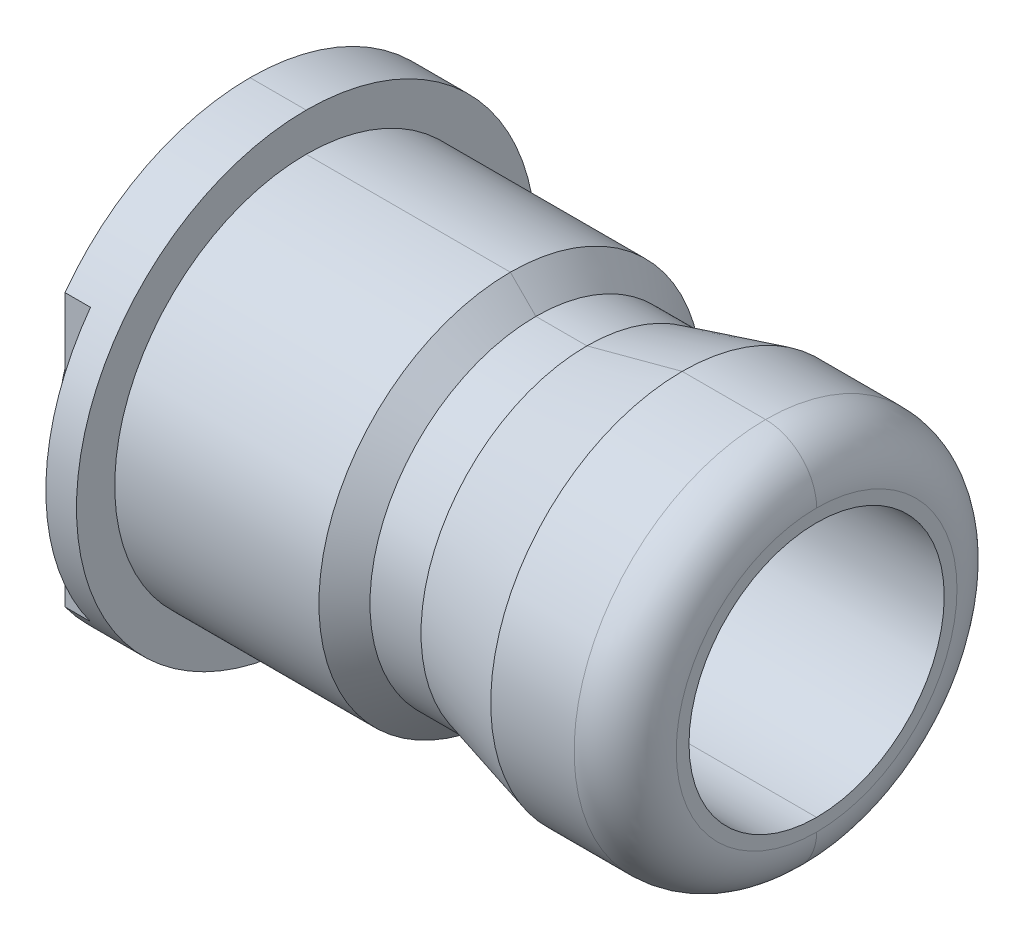
ISO-10303-21;
HEADER;
FILE_DESCRIPTION(('STEP AP214'),'2;1');
FILE_NAME('part.step','',(''),(''),'','','');
FILE_SCHEMA(('AUTOMOTIVE_DESIGN { 1 0 10303 214 1 1 1 1 }'));
ENDSEC;
DATA;
#1=APPLICATION_CONTEXT('core data for automotive mechanical design processes');
#2=APPLICATION_PROTOCOL_DEFINITION('international standard','automotive_design',2000,#1);
#3=PRODUCT_CONTEXT('',#1,'mechanical');
#4=PRODUCT('Part','Part','',(#3));
#5=PRODUCT_RELATED_PRODUCT_CATEGORY('part','',(#4));
#6=PRODUCT_DEFINITION_FORMATION('','',#4);
#7=PRODUCT_DEFINITION_CONTEXT('part definition',#1,'design');
#8=PRODUCT_DEFINITION('design','',#6,#7);
#9=PRODUCT_DEFINITION_SHAPE('','',#8);
#10=(LENGTH_UNIT() NAMED_UNIT(*) SI_UNIT(.MILLI.,.METRE.));
#11=(NAMED_UNIT(*) PLANE_ANGLE_UNIT() SI_UNIT($,.RADIAN.));
#12=(NAMED_UNIT(*) SI_UNIT($,.STERADIAN.) SOLID_ANGLE_UNIT());
#13=UNCERTAINTY_MEASURE_WITH_UNIT(LENGTH_MEASURE(1.E-05),#10,'distance_accuracy_value','');
#14=(GEOMETRIC_REPRESENTATION_CONTEXT(3) GLOBAL_UNCERTAINTY_ASSIGNED_CONTEXT((#13)) GLOBAL_UNIT_ASSIGNED_CONTEXT((#10,
#11,#12)) REPRESENTATION_CONTEXT('',''));
#15=CARTESIAN_POINT('',(0.,0.,0.));
#16=DIRECTION('',(0.,0.,1.));
#17=DIRECTION('',(1.,0.,0.));
#18=AXIS2_PLACEMENT_3D('',#15,#16,#17);
#19=CARTESIAN_POINT('',(-4.36,0.,0.));
#20=DIRECTION('',(1.,0.,0.));
#21=DIRECTION('',(0.,-1.,0.));
#22=AXIS2_PLACEMENT_3D('',#19,#20,#21);
#23=CYLINDRICAL_SURFACE('',#22,9.);
#24=DIRECTION('',(1.,0.,0.));
#25=VECTOR('',#24,1.);
#26=CARTESIAN_POINT('',(-2.2,5.332682251925,-7.25));
#27=LINE('',#26,#25);
#28=CARTESIAN_POINT('',(-2.2,5.332682251925,-7.25));
#29=VERTEX_POINT('',#28);
#30=CARTESIAN_POINT('',(-1.2,5.332682251925,-7.25));
#31=VERTEX_POINT('',#30);
#32=EDGE_CURVE('E27',#29,#31,#27,.T.);
#33=ORIENTED_EDGE('',*,*,#32,.F.);
#34=CARTESIAN_POINT('',(-2.2,0.,0.));
#35=DIRECTION('',(-1.,0.,0.));
#36=DIRECTION('',(0.,1.,0.));
#37=AXIS2_PLACEMENT_3D('',#34,#35,#36);
#38=CIRCLE('',#37,9.);
#39=CARTESIAN_POINT('',(-2.2,9.,0.));
#40=VERTEX_POINT('',#39);
#41=EDGE_CURVE('E353',#40,#29,#38,.T.);
#42=ORIENTED_EDGE('',*,*,#41,.F.);
#43=DIRECTION('',(-1.,0.,0.));
#44=VECTOR('',#43,1.);
#45=CARTESIAN_POINT('',(0.,9.,0.));
#46=LINE('',#45,#44);
#47=CARTESIAN_POINT('',(0.,9.,0.));
#48=VERTEX_POINT('',#47);
#49=EDGE_CURVE('E252',#48,#40,#46,.T.);
#50=ORIENTED_EDGE('',*,*,#49,.F.);
#51=CARTESIAN_POINT('',(0.,0.,0.));
#52=DIRECTION('',(-1.,0.,0.));
#53=DIRECTION('',(0.,1.,0.));
#54=AXIS2_PLACEMENT_3D('',#51,#52,#53);
#55=CIRCLE('',#54,9.);
#56=CARTESIAN_POINT('',(0.,-9.,0.));
#57=VERTEX_POINT('',#56);
#58=EDGE_CURVE('E369',#48,#57,#55,.T.);
#59=ORIENTED_EDGE('',*,*,#58,.T.);
#60=DIRECTION('',(-1.,0.,0.));
#61=VECTOR('',#60,1.);
#62=CARTESIAN_POINT('',(0.,-9.,0.));
#63=LINE('',#62,#61);
#64=CARTESIAN_POINT('',(-2.2,-9.,0.));
#65=VERTEX_POINT('',#64);
#66=EDGE_CURVE('E249',#57,#65,#63,.T.);
#67=ORIENTED_EDGE('',*,*,#66,.T.);
#68=CARTESIAN_POINT('',(-2.2,0.,0.));
#69=DIRECTION('',(-1.,0.,0.));
#70=DIRECTION('',(0.,-0.59252025021389,-0.805555555555586));
#71=AXIS2_PLACEMENT_3D('',#68,#69,#70);
#72=CIRCLE('',#71,9.);
#73=CARTESIAN_POINT('',(-2.2,-5.332682251925,-7.25));
#74=VERTEX_POINT('',#73);
#75=EDGE_CURVE('E387',#74,#65,#72,.T.);
#76=ORIENTED_EDGE('',*,*,#75,.F.);
#77=DIRECTION('',(1.,0.,0.));
#78=VECTOR('',#77,1.);
#79=CARTESIAN_POINT('',(-2.2,-5.332682251925,-7.25));
#80=LINE('',#79,#78);
#81=CARTESIAN_POINT('',(-1.2,-5.332682251925,-7.25));
#82=VERTEX_POINT('',#81);
#83=EDGE_CURVE('E11',#74,#82,#80,.T.);
#84=ORIENTED_EDGE('',*,*,#83,.T.);
#85=CARTESIAN_POINT('',(-1.2,0.,0.));
#86=DIRECTION('',(1.,0.,0.));
#87=DIRECTION('',(0.,-0.59252025021389,-0.805555555555586));
#88=AXIS2_PLACEMENT_3D('',#85,#86,#87);
#89=CIRCLE('',#88,9.);
#90=EDGE_CURVE('E388',#82,#31,#89,.T.);
#91=ORIENTED_EDGE('',*,*,#90,.T.);
#92=EDGE_LOOP('',(#33,#42,#50,#59,#67,#76,#84,#91));
#93=FACE_BOUND('',#92,.T.);
#94=ADVANCED_FACE('F16',(#93),#23,.T.);
#95=CARTESIAN_POINT('',(-2.2,-5.332682251925,-7.25));
#96=DIRECTION('',(0.,0.,1.));
#97=DIRECTION('',(1.,0.,0.));
#98=AXIS2_PLACEMENT_3D('',#95,#96,#97);
#99=PLANE('',#98);
#100=ORIENTED_EDGE('',*,*,#32,.T.);
#101=DIRECTION('',(0.,1.,0.));
#102=VECTOR('',#101,1.);
#103=CARTESIAN_POINT('',(-1.2,-5.332682251925,-7.25));
#104=LINE('',#103,#102);
#105=EDGE_CURVE('E362',#82,#31,#104,.T.);
#106=ORIENTED_EDGE('',*,*,#105,.F.);
#107=ORIENTED_EDGE('',*,*,#83,.F.);
#108=DIRECTION('',(0.,1.,0.));
#109=VECTOR('',#108,1.);
#110=CARTESIAN_POINT('',(-2.2,-5.332682251925,-7.25));
#111=LINE('',#110,#109);
#112=EDGE_CURVE('E348',#74,#29,#111,.T.);
#113=ORIENTED_EDGE('',*,*,#112,.T.);
#114=EDGE_LOOP('',(#100,#106,#107,#113));
#115=FACE_BOUND('',#114,.T.);
#116=ADVANCED_FACE('F491',(#115),#99,.F.);
#117=CARTESIAN_POINT('',(1.085559462452,4.5,0.));
#118=DIRECTION('',(-1.,0.,0.));
#119=DIRECTION('',(0.,1.,0.));
#120=AXIS2_PLACEMENT_3D('',#117,#118,#119);
#121=CONICAL_SURFACE('',#120,0.5303965024516,1.0471975511964);
#122=CARTESIAN_POINT('',(0.8,4.5,0.));
#123=DIRECTION('',(-1.,0.,0.));
#124=DIRECTION('',(0.,1.,0.));
#125=AXIS2_PLACEMENT_3D('',#122,#123,#124);
#126=CIRCLE('',#125,1.025);
#127=CARTESIAN_POINT('',(0.8,5.525,0.));
#128=VERTEX_POINT('',#127);
#129=CARTESIAN_POINT('',(0.8,3.475,0.));
#130=VERTEX_POINT('',#129);
#131=EDGE_CURVE('E340',#128,#130,#126,.T.);
#132=ORIENTED_EDGE('',*,*,#131,.T.);
#133=DIRECTION('',(-0.500000000000017,-0.866025403784429,0.));
#134=VECTOR('',#133,1.);
#135=CARTESIAN_POINT('',(1.391784025919,4.5,0.));
#136=LINE('',#135,#134);
#137=CARTESIAN_POINT('',(1.391784025919,4.5,0.));
#138=VERTEX_POINT('',#137);
#139=EDGE_CURVE('E448',#138,#130,#136,.T.);
#140=ORIENTED_EDGE('',*,*,#139,.F.);
#141=DIRECTION('',(-0.500000000000017,0.866025403784429,0.));
#142=VECTOR('',#141,1.);
#143=CARTESIAN_POINT('',(1.391784025919,4.5,0.));
#144=LINE('',#143,#142);
#145=EDGE_CURVE('E40',#138,#128,#144,.T.);
#146=ORIENTED_EDGE('',*,*,#145,.T.);
#147=EDGE_LOOP('',(#132,#140,#146));
#148=FACE_BOUND('',#147,.T.);
#149=ADVANCED_FACE('F514',(#148),#121,.F.);
#150=CARTESIAN_POINT('',(1.085559462452,4.5,0.));
#151=DIRECTION('',(-1.,0.,0.));
#152=DIRECTION('',(0.,1.,0.));
#153=AXIS2_PLACEMENT_3D('',#150,#151,#152);
#154=CONICAL_SURFACE('',#153,0.5303965024516,1.0471975511964);
#155=ORIENTED_EDGE('',*,*,#139,.T.);
#156=CARTESIAN_POINT('',(0.8,4.5,0.));
#157=DIRECTION('',(1.,0.,0.));
#158=DIRECTION('',(0.,1.,0.));
#159=AXIS2_PLACEMENT_3D('',#156,#157,#158);
#160=CIRCLE('',#159,1.025);
#161=EDGE_CURVE('E433',#128,#130,#160,.T.);
#162=ORIENTED_EDGE('',*,*,#161,.F.);
#163=ORIENTED_EDGE('',*,*,#145,.F.);
#164=EDGE_LOOP('',(#155,#162,#163));
#165=FACE_BOUND('',#164,.T.);
#166=ADVANCED_FACE('F559',(#165),#154,.F.);
#167=CARTESIAN_POINT('',(1.621373227215,4.5,0.));
#168=DIRECTION('',(-1.,0.,0.));
#169=DIRECTION('',(0.,1.,0.));
#170=AXIS2_PLACEMENT_3D('',#167,#168,#169);
#171=CYLINDRICAL_SURFACE('',#170,1.025);
#172=DIRECTION('',(-1.,0.,0.));
#173=VECTOR('',#172,1.);
#174=CARTESIAN_POINT('',(0.8,5.525,0.));
#175=LINE('',#174,#173);
#176=CARTESIAN_POINT('',(-3.2,5.525,0.));
#177=VERTEX_POINT('',#176);
#178=EDGE_CURVE('E430',#128,#177,#175,.T.);
#179=ORIENTED_EDGE('',*,*,#178,.F.);
#180=ORIENTED_EDGE('',*,*,#161,.T.);
#181=DIRECTION('',(-1.,0.,0.));
#182=VECTOR('',#181,1.);
#183=CARTESIAN_POINT('',(0.8,3.475,0.));
#184=LINE('',#183,#182);
#185=CARTESIAN_POINT('',(-3.2,3.475,0.));
#186=VERTEX_POINT('',#185);
#187=EDGE_CURVE('E337',#130,#186,#184,.T.);
#188=ORIENTED_EDGE('',*,*,#187,.T.);
#189=CARTESIAN_POINT('',(-3.2,4.5,0.));
#190=DIRECTION('',(-1.,0.,0.));
#191=DIRECTION('',(0.,-1.,0.));
#192=AXIS2_PLACEMENT_3D('',#189,#190,#191);
#193=CIRCLE('',#192,1.025);
#194=EDGE_CURVE('E325',#186,#177,#193,.T.);
#195=ORIENTED_EDGE('',*,*,#194,.T.);
#196=EDGE_LOOP('',(#179,#180,#188,#195));
#197=FACE_BOUND('',#196,.T.);
#198=ADVANCED_FACE('F564',(#197),#171,.F.);
#199=CARTESIAN_POINT('',(1.621373227215,4.5,0.));
#200=DIRECTION('',(-1.,0.,0.));
#201=DIRECTION('',(0.,1.,0.));
#202=AXIS2_PLACEMENT_3D('',#199,#200,#201);
#203=CYLINDRICAL_SURFACE('',#202,1.025);
#204=ORIENTED_EDGE('',*,*,#187,.F.);
#205=ORIENTED_EDGE('',*,*,#131,.F.);
#206=ORIENTED_EDGE('',*,*,#178,.T.);
#207=CARTESIAN_POINT('',(-3.2,4.5,0.));
#208=DIRECTION('',(-1.,0.,0.));
#209=DIRECTION('',(0.,1.,0.));
#210=AXIS2_PLACEMENT_3D('',#207,#208,#209);
#211=CIRCLE('',#210,1.025);
#212=EDGE_CURVE('E368',#177,#186,#211,.T.);
#213=ORIENTED_EDGE('',*,*,#212,.T.);
#214=EDGE_LOOP('',(#204,#205,#206,#213));
#215=FACE_BOUND('',#214,.T.);
#216=ADVANCED_FACE('F561',(#215),#203,.F.);
#217=CARTESIAN_POINT('',(-4.36,0.,0.));
#218=DIRECTION('',(1.,0.,0.));
#219=DIRECTION('',(0.,-1.,0.));
#220=AXIS2_PLACEMENT_3D('',#217,#218,#219);
#221=CYLINDRICAL_SURFACE('',#220,7.5);
#222=CARTESIAN_POINT('',(0.,0.,0.));
#223=DIRECTION('',(1.,0.,0.));
#224=DIRECTION('',(0.,1.,0.));
#225=AXIS2_PLACEMENT_3D('',#222,#223,#224);
#226=CIRCLE('',#225,7.5);
#227=CARTESIAN_POINT('',(0.,7.5,0.));
#228=VERTEX_POINT('',#227);
#229=CARTESIAN_POINT('',(0.,-7.5,0.));
#230=VERTEX_POINT('',#229);
#231=EDGE_CURVE('E401',#228,#230,#226,.T.);
#232=ORIENTED_EDGE('',*,*,#231,.T.);
#233=DIRECTION('',(-1.,0.,0.));
#234=VECTOR('',#233,1.);
#235=CARTESIAN_POINT('',(8.,-7.5,0.));
#236=LINE('',#235,#234);
#237=CARTESIAN_POINT('',(8.,-7.5,0.));
#238=VERTEX_POINT('',#237);
#239=EDGE_CURVE('E280',#238,#230,#236,.T.);
#240=ORIENTED_EDGE('',*,*,#239,.F.);
#241=CARTESIAN_POINT('',(8.,0.,0.));
#242=DIRECTION('',(1.,0.,0.));
#243=DIRECTION('',(0.,1.,0.));
#244=AXIS2_PLACEMENT_3D('',#241,#242,#243);
#245=CIRCLE('',#244,7.5);
#246=CARTESIAN_POINT('',(8.,7.5,0.));
#247=VERTEX_POINT('',#246);
#248=EDGE_CURVE('E254',#247,#238,#245,.T.);
#249=ORIENTED_EDGE('',*,*,#248,.F.);
#250=DIRECTION('',(-1.,0.,0.));
#251=VECTOR('',#250,1.);
#252=CARTESIAN_POINT('',(8.,7.5,0.));
#253=LINE('',#252,#251);
#254=EDGE_CURVE('E341',#247,#228,#253,.T.);
#255=ORIENTED_EDGE('',*,*,#254,.T.);
#256=EDGE_LOOP('',(#232,#240,#249,#255));
#257=FACE_BOUND('',#256,.T.);
#258=ADVANCED_FACE('F563',(#257),#221,.T.);
#259=CARTESIAN_POINT('',(-4.36,0.,0.));
#260=DIRECTION('',(1.,0.,0.));
#261=DIRECTION('',(0.,-1.,0.));
#262=AXIS2_PLACEMENT_3D('',#259,#260,#261);
#263=CYLINDRICAL_SURFACE('',#262,7.5);
#264=CARTESIAN_POINT('',(8.,0.,0.));
#265=DIRECTION('',(-1.,0.,0.));
#266=DIRECTION('',(0.,1.,0.));
#267=AXIS2_PLACEMENT_3D('',#264,#265,#266);
#268=CIRCLE('',#267,7.5);
#269=EDGE_CURVE('E276',#247,#238,#268,.T.);
#270=ORIENTED_EDGE('',*,*,#269,.T.);
#271=ORIENTED_EDGE('',*,*,#239,.T.);
#272=CARTESIAN_POINT('',(0.,0.,0.));
#273=DIRECTION('',(-1.,0.,0.));
#274=DIRECTION('',(0.,1.,0.));
#275=AXIS2_PLACEMENT_3D('',#272,#273,#274);
#276=CIRCLE('',#275,7.5);
#277=EDGE_CURVE('E397',#228,#230,#276,.T.);
#278=ORIENTED_EDGE('',*,*,#277,.F.);
#279=ORIENTED_EDGE('',*,*,#254,.F.);
#280=EDGE_LOOP('',(#270,#271,#278,#279));
#281=FACE_BOUND('',#280,.T.);
#282=ADVANCED_FACE('F570',(#281),#263,.T.);
#283=CARTESIAN_POINT('',(8.5,0.,0.));
#284=DIRECTION('',(-1.,0.,0.));
#285=DIRECTION('',(0.,1.,0.));
#286=AXIS2_PLACEMENT_3D('',#283,#284,#285);
#287=CONICAL_SURFACE('',#286,7.,0.7853981633973);
#288=CARTESIAN_POINT('',(9.,0.,0.));
#289=DIRECTION('',(-1.,0.,0.));
#290=DIRECTION('',(0.,1.,0.));
#291=AXIS2_PLACEMENT_3D('',#288,#289,#290);
#292=CIRCLE('',#291,6.5);
#293=CARTESIAN_POINT('',(9.,6.5,0.));
#294=VERTEX_POINT('',#293);
#295=CARTESIAN_POINT('',(9.,-6.5,0.));
#296=VERTEX_POINT('',#295);
#297=EDGE_CURVE('E316',#294,#296,#292,.T.);
#298=ORIENTED_EDGE('',*,*,#297,.T.);
#299=DIRECTION('',(-0.707106781186548,-0.707106781186548,0.));
#300=VECTOR('',#299,1.);
#301=CARTESIAN_POINT('',(9.,-6.5,0.));
#302=LINE('',#301,#300);
#303=EDGE_CURVE('E258',#296,#238,#302,.T.);
#304=ORIENTED_EDGE('',*,*,#303,.T.);
#305=ORIENTED_EDGE('',*,*,#269,.F.);
#306=DIRECTION('',(-0.707106781186548,0.707106781186548,0.));
#307=VECTOR('',#306,1.);
#308=CARTESIAN_POINT('',(9.,6.5,0.));
#309=LINE('',#308,#307);
#310=EDGE_CURVE('E281',#294,#247,#309,.T.);
#311=ORIENTED_EDGE('',*,*,#310,.F.);
#312=EDGE_LOOP('',(#298,#304,#305,#311));
#313=FACE_BOUND('',#312,.T.);
#314=ADVANCED_FACE('F589',(#313),#287,.T.);
#315=CARTESIAN_POINT('',(8.5,0.,0.));
#316=DIRECTION('',(-1.,0.,0.));
#317=DIRECTION('',(0.,1.,0.));
#318=AXIS2_PLACEMENT_3D('',#315,#316,#317);
#319=CONICAL_SURFACE('',#318,7.,0.7853981633973);
#320=ORIENTED_EDGE('',*,*,#248,.T.);
#321=ORIENTED_EDGE('',*,*,#303,.F.);
#322=CARTESIAN_POINT('',(9.,0.,0.));
#323=DIRECTION('',(1.,0.,0.));
#324=DIRECTION('',(0.,1.,0.));
#325=AXIS2_PLACEMENT_3D('',#322,#323,#324);
#326=CIRCLE('',#325,6.5);
#327=EDGE_CURVE('E259',#294,#296,#326,.T.);
#328=ORIENTED_EDGE('',*,*,#327,.F.);
#329=ORIENTED_EDGE('',*,*,#310,.T.);
#330=EDGE_LOOP('',(#320,#321,#328,#329));
#331=FACE_BOUND('',#330,.T.);
#332=ADVANCED_FACE('F524',(#331),#319,.T.);
#333=CARTESIAN_POINT('',(-4.36,0.,0.));
#334=DIRECTION('',(1.,0.,0.));
#335=DIRECTION('',(0.,-1.,0.));
#336=AXIS2_PLACEMENT_3D('',#333,#334,#335);
#337=CYLINDRICAL_SURFACE('',#336,6.5);
#338=ORIENTED_EDGE('',*,*,#327,.T.);
#339=DIRECTION('',(-1.,0.,0.));
#340=VECTOR('',#339,1.);
#341=CARTESIAN_POINT('',(11.,-6.5,0.));
#342=LINE('',#341,#340);
#343=CARTESIAN_POINT('',(11.,-6.5,0.));
#344=VERTEX_POINT('',#343);
#345=EDGE_CURVE('E321',#344,#296,#342,.T.);
#346=ORIENTED_EDGE('',*,*,#345,.F.);
#347=CARTESIAN_POINT('',(11.,0.,0.));
#348=DIRECTION('',(1.,0.,0.));
#349=DIRECTION('',(0.,1.,0.));
#350=AXIS2_PLACEMENT_3D('',#347,#348,#349);
#351=CIRCLE('',#350,6.5);
#352=CARTESIAN_POINT('',(11.,6.5,0.));
#353=VERTEX_POINT('',#352);
#354=EDGE_CURVE('E290',#353,#344,#351,.T.);
#355=ORIENTED_EDGE('',*,*,#354,.F.);
#356=DIRECTION('',(-1.,0.,0.));
#357=VECTOR('',#356,1.);
#358=CARTESIAN_POINT('',(11.,6.5,0.));
#359=LINE('',#358,#357);
#360=EDGE_CURVE('E320',#353,#294,#359,.T.);
#361=ORIENTED_EDGE('',*,*,#360,.T.);
#362=EDGE_LOOP('',(#338,#346,#355,#361));
#363=FACE_BOUND('',#362,.T.);
#364=ADVANCED_FACE('F520',(#363),#337,.T.);
#365=CARTESIAN_POINT('',(-4.36,0.,0.));
#366=DIRECTION('',(1.,0.,0.));
#367=DIRECTION('',(0.,-1.,0.));
#368=AXIS2_PLACEMENT_3D('',#365,#366,#367);
#369=CYLINDRICAL_SURFACE('',#368,6.5);
#370=CARTESIAN_POINT('',(11.,0.,0.));
#371=DIRECTION('',(-1.,0.,0.));
#372=DIRECTION('',(0.,1.,0.));
#373=AXIS2_PLACEMENT_3D('',#370,#371,#372);
#374=CIRCLE('',#373,6.5);
#375=EDGE_CURVE('E20',#353,#344,#374,.T.);
#376=ORIENTED_EDGE('',*,*,#375,.T.);
#377=ORIENTED_EDGE('',*,*,#345,.T.);
#378=ORIENTED_EDGE('',*,*,#297,.F.);
#379=ORIENTED_EDGE('',*,*,#360,.F.);
#380=EDGE_LOOP('',(#376,#377,#378,#379));
#381=FACE_BOUND('',#380,.T.);
#382=ADVANCED_FACE('F523',(#381),#369,.T.);
#383=CARTESIAN_POINT('',(12.86602540378,0.,0.));
#384=DIRECTION('',(1.,0.,0.));
#385=DIRECTION('',(0.,-1.,0.));
#386=AXIS2_PLACEMENT_3D('',#383,#384,#385);
#387=CONICAL_SURFACE('',#386,7.,0.2617993877991);
#388=CARTESIAN_POINT('',(14.73205080757,0.,0.));
#389=DIRECTION('',(-1.,0.,0.));
#390=DIRECTION('',(0.,1.,0.));
#391=AXIS2_PLACEMENT_3D('',#388,#389,#390);
#392=CIRCLE('',#391,7.5);
#393=CARTESIAN_POINT('',(14.73205080757,7.5,0.));
#394=VERTEX_POINT('',#393);
#395=CARTESIAN_POINT('',(14.73205080757,-7.5,0.));
#396=VERTEX_POINT('',#395);
#397=EDGE_CURVE('E212',#394,#396,#392,.T.);
#398=ORIENTED_EDGE('',*,*,#397,.T.);
#399=DIRECTION('',(-0.965925826289076,0.258819045102494,0.));
#400=VECTOR('',#399,1.);
#401=CARTESIAN_POINT('',(14.73205080757,-7.5,0.));
#402=LINE('',#401,#400);
#403=EDGE_CURVE('E219',#396,#344,#402,.T.);
#404=ORIENTED_EDGE('',*,*,#403,.T.);
#405=ORIENTED_EDGE('',*,*,#375,.F.);
#406=DIRECTION('',(-0.965925826289076,-0.258819045102494,0.));
#407=VECTOR('',#406,1.);
#408=CARTESIAN_POINT('',(14.73205080757,7.5,0.));
#409=LINE('',#408,#407);
#410=EDGE_CURVE('E207',#394,#353,#409,.T.);
#411=ORIENTED_EDGE('',*,*,#410,.F.);
#412=EDGE_LOOP('',(#398,#404,#405,#411));
#413=FACE_BOUND('',#412,.T.);
#414=ADVANCED_FACE('F209',(#413),#387,.T.);
#415=CARTESIAN_POINT('',(12.86602540378,0.,0.));
#416=DIRECTION('',(1.,0.,0.));
#417=DIRECTION('',(0.,-1.,0.));
#418=AXIS2_PLACEMENT_3D('',#415,#416,#417);
#419=CONICAL_SURFACE('',#418,7.,0.2617993877991);
#420=ORIENTED_EDGE('',*,*,#354,.T.);
#421=ORIENTED_EDGE('',*,*,#403,.F.);
#422=CARTESIAN_POINT('',(14.73205080757,0.,0.));
#423=DIRECTION('',(1.,0.,0.));
#424=DIRECTION('',(0.,1.,0.));
#425=AXIS2_PLACEMENT_3D('',#422,#423,#424);
#426=CIRCLE('',#425,7.5);
#427=EDGE_CURVE('E222',#394,#396,#426,.T.);
#428=ORIENTED_EDGE('',*,*,#427,.F.);
#429=ORIENTED_EDGE('',*,*,#410,.T.);
#430=EDGE_LOOP('',(#420,#421,#428,#429));
#431=FACE_BOUND('',#430,.T.);
#432=ADVANCED_FACE('F224',(#431),#419,.T.);
#433=CARTESIAN_POINT('',(18.,0.,0.));
#434=DIRECTION('',(1.,0.,0.));
#435=DIRECTION('',(0.,-0.999976951745723,-0.00678940183901416));
#436=AXIS2_PLACEMENT_3D('',#433,#434,#435);
#437=TOROIDAL_SURFACE('',#436,5.5,2.);
#438=CARTESIAN_POINT('',(18.,-5.5,-2.685396349733E-11));
#439=DIRECTION('',(0.,-4.882538817697E-12,1.));
#440=DIRECTION('',(0.,-1.,-4.882538817697E-12));
#441=AXIS2_PLACEMENT_3D('',#438,#439,#440);
#442=CIRCLE('',#441,2.);
#443=CARTESIAN_POINT('',(18.,-7.5,0.));
#444=VERTEX_POINT('',#443);
#445=CARTESIAN_POINT('',(20.,-5.500000003936,0.));
#446=VERTEX_POINT('',#445);
#447=EDGE_CURVE('E315',#444,#446,#442,.T.);
#448=ORIENTED_EDGE('',*,*,#447,.T.);
#449=CARTESIAN_POINT('',(20.,0.,0.));
#450=DIRECTION('',(-1.,0.,0.));
#451=DIRECTION('',(0.,-1.,0.));
#452=AXIS2_PLACEMENT_3D('',#449,#450,#451);
#453=CIRCLE('',#452,5.500000003936);
#454=CARTESIAN_POINT('',(20.,5.500000003936,0.));
#455=VERTEX_POINT('',#454);
#456=EDGE_CURVE('E282',#446,#455,#453,.T.);
#457=ORIENTED_EDGE('',*,*,#456,.T.);
#458=CARTESIAN_POINT('',(18.,5.5,2.685342226361E-11));
#459=DIRECTION('',(0.,4.882439938458E-12,-1.));
#460=DIRECTION('',(0.,1.,4.882439938458E-12));
#461=AXIS2_PLACEMENT_3D('',#458,#459,#460);
#462=CIRCLE('',#461,2.);
#463=CARTESIAN_POINT('',(18.,7.5,0.));
#464=VERTEX_POINT('',#463);
#465=EDGE_CURVE('E354',#464,#455,#462,.T.);
#466=ORIENTED_EDGE('',*,*,#465,.F.);
#467=CARTESIAN_POINT('',(18.,0.,0.));
#468=DIRECTION('',(-1.,0.,0.));
#469=DIRECTION('',(0.,-1.,0.));
#470=AXIS2_PLACEMENT_3D('',#467,#468,#469);
#471=CIRCLE('',#470,7.5);
#472=EDGE_CURVE('E228',#444,#464,#471,.T.);
#473=ORIENTED_EDGE('',*,*,#472,.F.);
#474=EDGE_LOOP('',(#448,#457,#466,#473));
#475=FACE_BOUND('',#474,.T.);
#476=ADVANCED_FACE('F549',(#475),#437,.T.);
#477=CARTESIAN_POINT('',(-4.36,0.,0.));
#478=DIRECTION('',(1.,0.,0.));
#479=DIRECTION('',(0.,-1.,0.));
#480=AXIS2_PLACEMENT_3D('',#477,#478,#479);
#481=CYLINDRICAL_SURFACE('',#480,7.5);
#482=DIRECTION('',(-1.,0.,4.794024980808E-13));
#483=VECTOR('',#482,1.);
#484=CARTESIAN_POINT('',(18.,7.5,-1.565744521353E-12));
#485=LINE('',#484,#483);
#486=EDGE_CURVE('E229',#464,#394,#485,.T.);
#487=ORIENTED_EDGE('',*,*,#486,.T.);
#488=ORIENTED_EDGE('',*,*,#427,.T.);
#489=DIRECTION('',(-1.,0.,-4.783833056523E-13));
#490=VECTOR('',#489,1.);
#491=CARTESIAN_POINT('',(18.,-7.5,1.562413852279E-12));
#492=LINE('',#491,#490);
#493=EDGE_CURVE('E239',#444,#396,#492,.T.);
#494=ORIENTED_EDGE('',*,*,#493,.F.);
#495=ORIENTED_EDGE('',*,*,#472,.T.);
#496=EDGE_LOOP('',(#487,#488,#494,#495));
#497=FACE_BOUND('',#496,.T.);
#498=ADVANCED_FACE('F232',(#497),#481,.T.);
#499=CARTESIAN_POINT('',(-4.36,0.,0.));
#500=DIRECTION('',(1.,0.,0.));
#501=DIRECTION('',(0.,-1.,0.));
#502=AXIS2_PLACEMENT_3D('',#499,#500,#501);
#503=CYLINDRICAL_SURFACE('',#502,7.5);
#504=ORIENTED_EDGE('',*,*,#493,.T.);
#505=ORIENTED_EDGE('',*,*,#397,.F.);
#506=ORIENTED_EDGE('',*,*,#486,.F.);
#507=CARTESIAN_POINT('',(18.,0.,0.));
#508=DIRECTION('',(-1.,0.,0.));
#509=DIRECTION('',(0.,1.,0.));
#510=AXIS2_PLACEMENT_3D('',#507,#508,#509);
#511=CIRCLE('',#510,7.5);
#512=EDGE_CURVE('E245',#464,#444,#511,.T.);
#513=ORIENTED_EDGE('',*,*,#512,.T.);
#514=EDGE_LOOP('',(#504,#505,#506,#513));
#515=FACE_BOUND('',#514,.T.);
#516=ADVANCED_FACE('F238',(#515),#503,.T.);
#517=CARTESIAN_POINT('',(18.,0.,0.));
#518=DIRECTION('',(1.,0.,0.));
#519=DIRECTION('',(0.,0.999976951745723,0.00678940183901416));
#520=AXIS2_PLACEMENT_3D('',#517,#518,#519);
#521=TOROIDAL_SURFACE('',#520,5.5,2.);
#522=ORIENTED_EDGE('',*,*,#465,.T.);
#523=CARTESIAN_POINT('',(20.,0.,0.));
#524=DIRECTION('',(-1.,0.,0.));
#525=DIRECTION('',(0.,1.,0.));
#526=AXIS2_PLACEMENT_3D('',#523,#524,#525);
#527=CIRCLE('',#526,5.500000003936);
#528=EDGE_CURVE('E285',#455,#446,#527,.T.);
#529=ORIENTED_EDGE('',*,*,#528,.T.);
#530=ORIENTED_EDGE('',*,*,#447,.F.);
#531=ORIENTED_EDGE('',*,*,#512,.F.);
#532=EDGE_LOOP('',(#522,#529,#530,#531));
#533=FACE_BOUND('',#532,.T.);
#534=ADVANCED_FACE('F538',(#533),#521,.T.);
#535=CARTESIAN_POINT('',(20.,0.,0.));
#536=DIRECTION('',(1.,0.,0.));
#537=DIRECTION('',(0.,1.,0.));
#538=AXIS2_PLACEMENT_3D('',#535,#536,#537);
#539=PLANE('',#538);
#540=CARTESIAN_POINT('',(20.,0.,0.));
#541=DIRECTION('',(1.,0.,0.));
#542=DIRECTION('',(0.,1.,0.));
#543=AXIS2_PLACEMENT_3D('',#540,#541,#542);
#544=CIRCLE('',#543,5.);
#545=CARTESIAN_POINT('',(20.,5.,0.));
#546=VERTEX_POINT('',#545);
#547=CARTESIAN_POINT('',(20.,-5.,0.));
#548=VERTEX_POINT('',#547);
#549=EDGE_CURVE('E310',#546,#548,#544,.T.);
#550=ORIENTED_EDGE('',*,*,#549,.F.);
#551=CARTESIAN_POINT('',(20.,0.,0.));
#552=DIRECTION('',(-1.,0.,0.));
#553=DIRECTION('',(0.,1.,0.));
#554=AXIS2_PLACEMENT_3D('',#551,#552,#553);
#555=CIRCLE('',#554,5.);
#556=EDGE_CURVE('E286',#546,#548,#555,.T.);
#557=ORIENTED_EDGE('',*,*,#556,.T.);
#558=EDGE_LOOP('',(#550,#557));
#559=FACE_BOUND('',#558,.T.);
#560=ORIENTED_EDGE('',*,*,#456,.F.);
#561=ORIENTED_EDGE('',*,*,#528,.F.);
#562=EDGE_LOOP('',(#560,#561));
#563=FACE_BOUND('',#562,.T.);
#564=ADVANCED_FACE('F530',(#559,#563),#539,.T.);
#565=CARTESIAN_POINT('',(-4.36,0.,0.));
#566=DIRECTION('',(1.,0.,0.));
#567=DIRECTION('',(0.,-1.,0.));
#568=AXIS2_PLACEMENT_3D('',#565,#566,#567);
#569=CYLINDRICAL_SURFACE('',#568,5.);
#570=CARTESIAN_POINT('',(3.3,0.,0.));
#571=DIRECTION('',(-1.,0.,0.));
#572=DIRECTION('',(0.,1.,0.));
#573=AXIS2_PLACEMENT_3D('',#570,#571,#572);
#574=CIRCLE('',#573,5.);
#575=CARTESIAN_POINT('',(3.3,5.,0.));
#576=VERTEX_POINT('',#575);
#577=CARTESIAN_POINT('',(3.3,-5.,0.));
#578=VERTEX_POINT('',#577);
#579=EDGE_CURVE('E301',#576,#578,#574,.T.);
#580=ORIENTED_EDGE('',*,*,#579,.T.);
#581=DIRECTION('',(1.,0.,0.));
#582=VECTOR('',#581,1.);
#583=CARTESIAN_POINT('',(3.3,-5.,0.));
#584=LINE('',#583,#582);
#585=EDGE_CURVE('E298',#578,#548,#584,.T.);
#586=ORIENTED_EDGE('',*,*,#585,.T.);
#587=ORIENTED_EDGE('',*,*,#556,.F.);
#588=DIRECTION('',(1.,0.,0.));
#589=VECTOR('',#588,1.);
#590=CARTESIAN_POINT('',(3.3,5.,0.));
#591=LINE('',#590,#589);
#592=EDGE_CURVE('E294',#576,#546,#591,.T.);
#593=ORIENTED_EDGE('',*,*,#592,.F.);
#594=EDGE_LOOP('',(#580,#586,#587,#593));
#595=FACE_BOUND('',#594,.T.);
#596=ADVANCED_FACE('F527',(#595),#569,.F.);
#597=CARTESIAN_POINT('',(-4.36,0.,0.));
#598=DIRECTION('',(1.,0.,0.));
#599=DIRECTION('',(0.,-1.,0.));
#600=AXIS2_PLACEMENT_3D('',#597,#598,#599);
#601=CYLINDRICAL_SURFACE('',#600,5.);
#602=ORIENTED_EDGE('',*,*,#549,.T.);
#603=ORIENTED_EDGE('',*,*,#585,.F.);
#604=CARTESIAN_POINT('',(3.3,0.,0.));
#605=DIRECTION('',(1.,0.,0.));
#606=DIRECTION('',(0.,1.,0.));
#607=AXIS2_PLACEMENT_3D('',#604,#605,#606);
#608=CIRCLE('',#607,5.);
#609=EDGE_CURVE('E304',#576,#578,#608,.T.);
#610=ORIENTED_EDGE('',*,*,#609,.F.);
#611=ORIENTED_EDGE('',*,*,#592,.T.);
#612=EDGE_LOOP('',(#602,#603,#610,#611));
#613=FACE_BOUND('',#612,.T.);
#614=ADVANCED_FACE('F529',(#613),#601,.F.);
#615=CARTESIAN_POINT('',(3.3,0.,0.));
#616=DIRECTION('',(1.,0.,0.));
#617=DIRECTION('',(0.,1.,0.));
#618=AXIS2_PLACEMENT_3D('',#615,#616,#617);
#619=PLANE('',#618);
#620=CARTESIAN_POINT('',(3.3,0.,0.));
#621=DIRECTION('',(1.,0.,0.));
#622=DIRECTION('',(0.,1.,0.));
#623=AXIS2_PLACEMENT_3D('',#620,#621,#622);
#624=CIRCLE('',#623,2.25);
#625=CARTESIAN_POINT('',(3.3,2.25,0.));
#626=VERTEX_POINT('',#625);
#627=CARTESIAN_POINT('',(3.3,-2.25,0.));
#628=VERTEX_POINT('',#627);
#629=EDGE_CURVE('E265',#626,#628,#624,.T.);
#630=ORIENTED_EDGE('',*,*,#629,.F.);
#631=CARTESIAN_POINT('',(3.3,0.,0.));
#632=DIRECTION('',(-1.,0.,0.));
#633=DIRECTION('',(0.,1.,0.));
#634=AXIS2_PLACEMENT_3D('',#631,#632,#633);
#635=CIRCLE('',#634,2.25);
#636=EDGE_CURVE('E305',#626,#628,#635,.T.);
#637=ORIENTED_EDGE('',*,*,#636,.T.);
#638=EDGE_LOOP('',(#630,#637));
#639=FACE_BOUND('',#638,.T.);
#640=ORIENTED_EDGE('',*,*,#579,.F.);
#641=ORIENTED_EDGE('',*,*,#609,.T.);
#642=EDGE_LOOP('',(#640,#641));
#643=FACE_BOUND('',#642,.T.);
#644=ADVANCED_FACE('F417',(#639,#643),#619,.T.);
#645=CARTESIAN_POINT('',(-4.36,0.,0.));
#646=DIRECTION('',(1.,0.,0.));
#647=DIRECTION('',(0.,-1.,0.));
#648=AXIS2_PLACEMENT_3D('',#645,#646,#647);
#649=CYLINDRICAL_SURFACE('',#648,2.25);
#650=CARTESIAN_POINT('',(-3.2,0.,0.));
#651=DIRECTION('',(-1.,0.,0.));
#652=DIRECTION('',(0.,1.,0.));
#653=AXIS2_PLACEMENT_3D('',#650,#651,#652);
#654=CIRCLE('',#653,2.25);
#655=CARTESIAN_POINT('',(-3.2,2.25,0.));
#656=VERTEX_POINT('',#655);
#657=CARTESIAN_POINT('',(-3.2,-2.25,0.));
#658=VERTEX_POINT('',#657);
#659=EDGE_CURVE('E293',#656,#658,#654,.T.);
#660=ORIENTED_EDGE('',*,*,#659,.T.);
#661=DIRECTION('',(1.,0.,0.));
#662=VECTOR('',#661,1.);
#663=CARTESIAN_POINT('',(-3.2,-2.25,0.));
#664=LINE('',#663,#662);
#665=EDGE_CURVE('E260',#658,#628,#664,.T.);
#666=ORIENTED_EDGE('',*,*,#665,.T.);
#667=ORIENTED_EDGE('',*,*,#636,.F.);
#668=DIRECTION('',(1.,0.,0.));
#669=VECTOR('',#668,1.);
#670=CARTESIAN_POINT('',(-3.2,2.25,0.));
#671=LINE('',#670,#669);
#672=EDGE_CURVE('E264',#656,#626,#671,.T.);
#673=ORIENTED_EDGE('',*,*,#672,.F.);
#674=EDGE_LOOP('',(#660,#666,#667,#673));
#675=FACE_BOUND('',#674,.T.);
#676=ADVANCED_FACE('F593',(#675),#649,.F.);
#677=CARTESIAN_POINT('',(-4.36,0.,0.));
#678=DIRECTION('',(1.,0.,0.));
#679=DIRECTION('',(0.,-1.,0.));
#680=AXIS2_PLACEMENT_3D('',#677,#678,#679);
#681=CYLINDRICAL_SURFACE('',#680,2.25);
#682=ORIENTED_EDGE('',*,*,#629,.T.);
#683=ORIENTED_EDGE('',*,*,#665,.F.);
#684=CARTESIAN_POINT('',(-3.2,0.,0.));
#685=DIRECTION('',(1.,0.,0.));
#686=DIRECTION('',(0.,1.,0.));
#687=AXIS2_PLACEMENT_3D('',#684,#685,#686);
#688=CIRCLE('',#687,2.25);
#689=EDGE_CURVE('E322',#656,#658,#688,.T.);
#690=ORIENTED_EDGE('',*,*,#689,.F.);
#691=ORIENTED_EDGE('',*,*,#672,.T.);
#692=EDGE_LOOP('',(#682,#683,#690,#691));
#693=FACE_BOUND('',#692,.T.);
#694=ADVANCED_FACE('F18',(#693),#681,.F.);
#695=CARTESIAN_POINT('',(-3.2,0.,0.));
#696=DIRECTION('',(1.,0.,0.));
#697=DIRECTION('',(0.,1.,0.));
#698=AXIS2_PLACEMENT_3D('',#695,#696,#697);
#699=PLANE('',#698);
#700=ORIENTED_EDGE('',*,*,#194,.F.);
#701=ORIENTED_EDGE('',*,*,#212,.F.);
#702=EDGE_LOOP('',(#700,#701));
#703=FACE_BOUND('',#702,.T.);
#704=ORIENTED_EDGE('',*,*,#659,.F.);
#705=ORIENTED_EDGE('',*,*,#689,.T.);
#706=EDGE_LOOP('',(#704,#705));
#707=FACE_BOUND('',#706,.T.);
#708=CARTESIAN_POINT('',(-3.2,0.,0.));
#709=DIRECTION('',(1.,0.,0.));
#710=DIRECTION('',(0.,1.,0.));
#711=AXIS2_PLACEMENT_3D('',#708,#709,#710);
#712=CIRCLE('',#711,6.5);
#713=CARTESIAN_POINT('',(-3.2,6.5,0.));
#714=VERTEX_POINT('',#713);
#715=CARTESIAN_POINT('',(-3.2,-6.5,0.));
#716=VERTEX_POINT('',#715);
#717=EDGE_CURVE('E405',#714,#716,#712,.T.);
#718=ORIENTED_EDGE('',*,*,#717,.F.);
#719=CARTESIAN_POINT('',(-3.2,0.,0.));
#720=DIRECTION('',(-1.,0.,0.));
#721=DIRECTION('',(0.,1.,0.));
#722=AXIS2_PLACEMENT_3D('',#719,#720,#721);
#723=CIRCLE('',#722,6.5);
#724=EDGE_CURVE('E270',#714,#716,#723,.T.);
#725=ORIENTED_EDGE('',*,*,#724,.T.);
#726=EDGE_LOOP('',(#718,#725));
#727=FACE_BOUND('',#726,.T.);
#728=ADVANCED_FACE('F585',(#703,#707,#727),#699,.F.);
#729=CARTESIAN_POINT('',(-4.36,0.,0.));
#730=DIRECTION('',(1.,0.,0.));
#731=DIRECTION('',(0.,-1.,0.));
#732=AXIS2_PLACEMENT_3D('',#729,#730,#731);
#733=CYLINDRICAL_SURFACE('',#732,6.5);
#734=CARTESIAN_POINT('',(-2.2,0.,0.));
#735=DIRECTION('',(-1.,0.,0.));
#736=DIRECTION('',(0.,1.,0.));
#737=AXIS2_PLACEMENT_3D('',#734,#735,#736);
#738=CIRCLE('',#737,6.5);
#739=CARTESIAN_POINT('',(-2.2,6.5,0.));
#740=VERTEX_POINT('',#739);
#741=CARTESIAN_POINT('',(-2.2,-6.5,0.));
#742=VERTEX_POINT('',#741);
#743=EDGE_CURVE('E352',#740,#742,#738,.T.);
#744=ORIENTED_EDGE('',*,*,#743,.T.);
#745=DIRECTION('',(-1.,0.,0.));
#746=VECTOR('',#745,1.);
#747=CARTESIAN_POINT('',(-2.2,-6.5,0.));
#748=LINE('',#747,#746);
#749=EDGE_CURVE('E271',#742,#716,#748,.T.);
#750=ORIENTED_EDGE('',*,*,#749,.T.);
#751=ORIENTED_EDGE('',*,*,#724,.F.);
#752=DIRECTION('',(-1.,0.,0.));
#753=VECTOR('',#752,1.);
#754=CARTESIAN_POINT('',(-2.2,6.5,0.));
#755=LINE('',#754,#753);
#756=EDGE_CURVE('E266',#740,#714,#755,.T.);
#757=ORIENTED_EDGE('',*,*,#756,.F.);
#758=EDGE_LOOP('',(#744,#750,#751,#757));
#759=FACE_BOUND('',#758,.T.);
#760=ADVANCED_FACE('F610',(#759),#733,.T.);
#761=CARTESIAN_POINT('',(-4.36,0.,0.));
#762=DIRECTION('',(1.,0.,0.));
#763=DIRECTION('',(0.,-1.,0.));
#764=AXIS2_PLACEMENT_3D('',#761,#762,#763);
#765=CYLINDRICAL_SURFACE('',#764,6.5);
#766=ORIENTED_EDGE('',*,*,#717,.T.);
#767=ORIENTED_EDGE('',*,*,#749,.F.);
#768=CARTESIAN_POINT('',(-2.2,0.,0.));
#769=DIRECTION('',(1.,0.,0.));
#770=DIRECTION('',(0.,1.,0.));
#771=AXIS2_PLACEMENT_3D('',#768,#769,#770);
#772=CIRCLE('',#771,6.5);
#773=EDGE_CURVE('E402',#740,#742,#772,.T.);
#774=ORIENTED_EDGE('',*,*,#773,.F.);
#775=ORIENTED_EDGE('',*,*,#756,.T.);
#776=EDGE_LOOP('',(#766,#767,#774,#775));
#777=FACE_BOUND('',#776,.T.);
#778=ADVANCED_FACE('F518',(#777),#765,.T.);
#779=CARTESIAN_POINT('',(-2.2,0.,0.));
#780=DIRECTION('',(1.,0.,0.));
#781=DIRECTION('',(0.,1.,0.));
#782=AXIS2_PLACEMENT_3D('',#779,#780,#781);
#783=PLANE('',#782);
#784=ORIENTED_EDGE('',*,*,#743,.F.);
#785=ORIENTED_EDGE('',*,*,#773,.T.);
#786=EDGE_LOOP('',(#784,#785));
#787=FACE_BOUND('',#786,.T.);
#788=ORIENTED_EDGE('',*,*,#75,.T.);
#789=CARTESIAN_POINT('',(-2.2,0.,0.));
#790=DIRECTION('',(1.,0.,0.));
#791=DIRECTION('',(0.,-0.59252025021389,0.805555555555586));
#792=AXIS2_PLACEMENT_3D('',#789,#790,#791);
#793=CIRCLE('',#792,9.);
#794=CARTESIAN_POINT('',(-2.2,-5.332682251925,7.25));
#795=VERTEX_POINT('',#794);
#796=EDGE_CURVE('E253',#795,#65,#793,.T.);
#797=ORIENTED_EDGE('',*,*,#796,.F.);
#798=DIRECTION('',(0.,-1.,0.));
#799=VECTOR('',#798,1.);
#800=CARTESIAN_POINT('',(-2.2,5.332682251925,7.25));
#801=LINE('',#800,#799);
#802=CARTESIAN_POINT('',(-2.2,5.332682251925,7.25));
#803=VERTEX_POINT('',#802);
#804=EDGE_CURVE('E384',#803,#795,#801,.T.);
#805=ORIENTED_EDGE('',*,*,#804,.F.);
#806=CARTESIAN_POINT('',(-2.2,0.,0.));
#807=DIRECTION('',(1.,0.,0.));
#808=DIRECTION('',(0.,1.,0.));
#809=AXIS2_PLACEMENT_3D('',#806,#807,#808);
#810=CIRCLE('',#809,9.);
#811=EDGE_CURVE('E330',#40,#803,#810,.T.);
#812=ORIENTED_EDGE('',*,*,#811,.F.);
#813=ORIENTED_EDGE('',*,*,#41,.T.);
#814=ORIENTED_EDGE('',*,*,#112,.F.);
#815=EDGE_LOOP('',(#788,#797,#805,#812,#813,#814));
#816=FACE_BOUND('',#815,.T.);
#817=ADVANCED_FACE('F483',(#787,#816),#783,.F.);
#818=CARTESIAN_POINT('',(-2.2,5.332682251925,7.25));
#819=DIRECTION('',(0.,0.,-1.));
#820=DIRECTION('',(0.,-1.,0.));
#821=AXIS2_PLACEMENT_3D('',#818,#819,#820);
#822=PLANE('',#821);
#823=DIRECTION('',(1.,0.,0.));
#824=VECTOR('',#823,1.);
#825=CARTESIAN_POINT('',(-2.2,-5.332682251925,7.25));
#826=LINE('',#825,#824);
#827=CARTESIAN_POINT('',(-1.2,-5.332682251925,7.25));
#828=VERTEX_POINT('',#827);
#829=EDGE_CURVE('E275',#795,#828,#826,.T.);
#830=ORIENTED_EDGE('',*,*,#829,.T.);
#831=DIRECTION('',(0.,-1.,0.));
#832=VECTOR('',#831,1.);
#833=CARTESIAN_POINT('',(-1.2,5.332682251925,7.25));
#834=LINE('',#833,#832);
#835=CARTESIAN_POINT('',(-1.2,5.332682251925,7.25));
#836=VERTEX_POINT('',#835);
#837=EDGE_CURVE('E346',#836,#828,#834,.T.);
#838=ORIENTED_EDGE('',*,*,#837,.F.);
#839=DIRECTION('',(1.,0.,0.));
#840=VECTOR('',#839,1.);
#841=CARTESIAN_POINT('',(-2.2,5.332682251925,7.25));
#842=LINE('',#841,#840);
#843=EDGE_CURVE('E347',#803,#836,#842,.T.);
#844=ORIENTED_EDGE('',*,*,#843,.F.);
#845=ORIENTED_EDGE('',*,*,#804,.T.);
#846=EDGE_LOOP('',(#830,#838,#844,#845));
#847=FACE_BOUND('',#846,.T.);
#848=ADVANCED_FACE('F496',(#847),#822,.F.);
#849=CARTESIAN_POINT('',(-1.2,0.,0.));
#850=DIRECTION('',(-1.,0.,0.));
#851=DIRECTION('',(0.,0.,1.));
#852=AXIS2_PLACEMENT_3D('',#849,#850,#851);
#853=PLANE('',#852);
#854=ORIENTED_EDGE('',*,*,#105,.T.);
#855=ORIENTED_EDGE('',*,*,#90,.F.);
#856=EDGE_LOOP('',(#854,#855));
#857=FACE_BOUND('',#856,.T.);
#858=ADVANCED_FACE('F493',(#857),#853,.T.);
#859=CARTESIAN_POINT('',(-1.2,0.,0.));
#860=DIRECTION('',(-1.,0.,0.));
#861=DIRECTION('',(0.,0.,1.));
#862=AXIS2_PLACEMENT_3D('',#859,#860,#861);
#863=PLANE('',#862);
#864=ORIENTED_EDGE('',*,*,#837,.T.);
#865=CARTESIAN_POINT('',(-1.2,0.,0.));
#866=DIRECTION('',(1.,0.,0.));
#867=DIRECTION('',(0.,0.59252025021389,0.805555555555586));
#868=AXIS2_PLACEMENT_3D('',#865,#866,#867);
#869=CIRCLE('',#868,9.);
#870=EDGE_CURVE('E342',#836,#828,#869,.T.);
#871=ORIENTED_EDGE('',*,*,#870,.F.);
#872=EDGE_LOOP('',(#864,#871));
#873=FACE_BOUND('',#872,.T.);
#874=ADVANCED_FACE('F495',(#873),#863,.T.);
#875=CARTESIAN_POINT('',(-4.36,0.,0.));
#876=DIRECTION('',(1.,0.,0.));
#877=DIRECTION('',(0.,-1.,0.));
#878=AXIS2_PLACEMENT_3D('',#875,#876,#877);
#879=CYLINDRICAL_SURFACE('',#878,9.);
#880=ORIENTED_EDGE('',*,*,#829,.F.);
#881=ORIENTED_EDGE('',*,*,#796,.T.);
#882=ORIENTED_EDGE('',*,*,#66,.F.);
#883=CARTESIAN_POINT('',(0.,0.,0.));
#884=DIRECTION('',(1.,0.,0.));
#885=DIRECTION('',(0.,1.,0.));
#886=AXIS2_PLACEMENT_3D('',#883,#884,#885);
#887=CIRCLE('',#886,9.);
#888=EDGE_CURVE('E373',#48,#57,#887,.T.);
#889=ORIENTED_EDGE('',*,*,#888,.F.);
#890=ORIENTED_EDGE('',*,*,#49,.T.);
#891=ORIENTED_EDGE('',*,*,#811,.T.);
#892=ORIENTED_EDGE('',*,*,#843,.T.);
#893=ORIENTED_EDGE('',*,*,#870,.T.);
#894=EDGE_LOOP('',(#880,#881,#882,#889,#890,#891,#892,#893));
#895=FACE_BOUND('',#894,.T.);
#896=ADVANCED_FACE('F503',(#895),#879,.T.);
#897=CARTESIAN_POINT('',(0.,0.,0.));
#898=DIRECTION('',(1.,0.,0.));
#899=DIRECTION('',(0.,1.,0.));
#900=AXIS2_PLACEMENT_3D('',#897,#898,#899);
#901=PLANE('',#900);
#902=ORIENTED_EDGE('',*,*,#231,.F.);
#903=ORIENTED_EDGE('',*,*,#277,.T.);
#904=EDGE_LOOP('',(#902,#903));
#905=FACE_BOUND('',#904,.T.);
#906=ORIENTED_EDGE('',*,*,#58,.F.);
#907=ORIENTED_EDGE('',*,*,#888,.T.);
#908=EDGE_LOOP('',(#906,#907));
#909=FACE_BOUND('',#908,.T.);
#910=ADVANCED_FACE('F600',(#905,#909),#901,.T.);
#911=CLOSED_SHELL('',(#94,#116,#149,#166,#198,#216,#258,#282,#314,#332,#364,#382,#414,#432,#476,
#498,#516,#534,#564,#596,#614,#644,#676,#694,#728,#760,#778,#817,#848,#858,#874,#896,#910));
#912=MANIFOLD_SOLID_BREP('B1',#911);
#913=ADVANCED_BREP_SHAPE_REPRESENTATION('',(#18,#912),#14);
#914=SHAPE_DEFINITION_REPRESENTATION(#9,#913);
ENDSEC;
END-ISO-10303-21;
